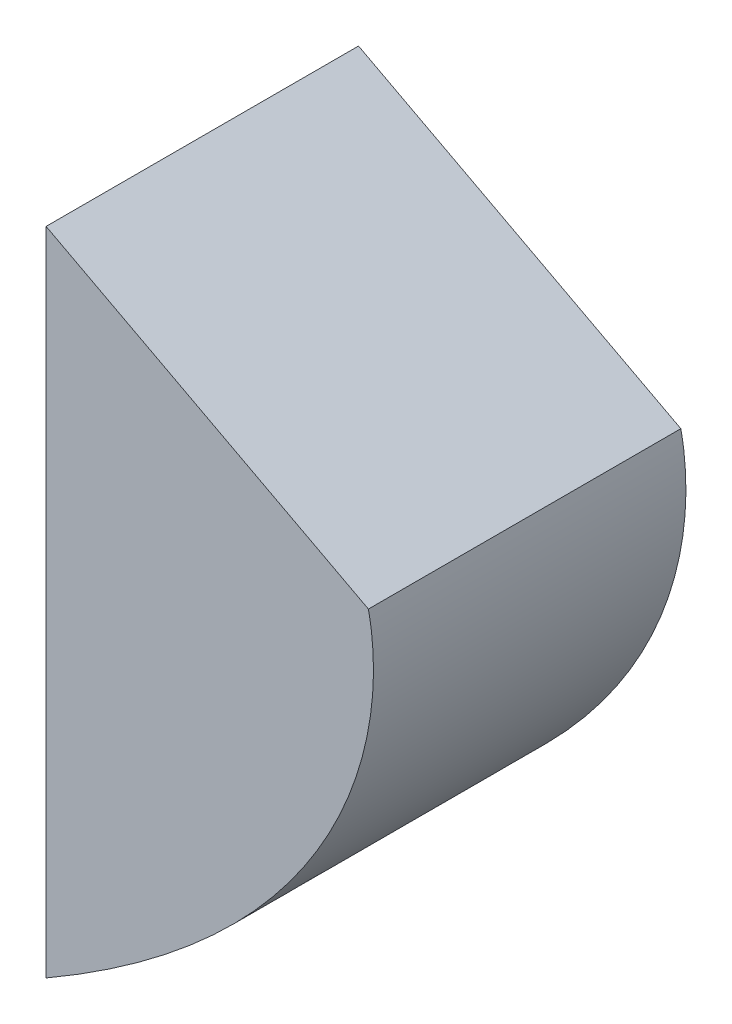
ISO-10303-21;
HEADER;
FILE_DESCRIPTION(('STEP AP214'),'2;1');
FILE_NAME('part.step','',(''),(''),'','','');
FILE_SCHEMA(('AUTOMOTIVE_DESIGN { 1 0 10303 214 1 1 1 1 }'));
ENDSEC;
DATA;
#1=APPLICATION_CONTEXT('core data for automotive mechanical design processes');
#2=APPLICATION_PROTOCOL_DEFINITION('international standard','automotive_design',2000,#1);
#3=PRODUCT_CONTEXT('',#1,'mechanical');
#4=PRODUCT('Part','Part','',(#3));
#5=PRODUCT_RELATED_PRODUCT_CATEGORY('part','',(#4));
#6=PRODUCT_DEFINITION_FORMATION('','',#4);
#7=PRODUCT_DEFINITION_CONTEXT('part definition',#1,'design');
#8=PRODUCT_DEFINITION('design','',#6,#7);
#9=PRODUCT_DEFINITION_SHAPE('','',#8);
#10=(LENGTH_UNIT() NAMED_UNIT(*) SI_UNIT(.MILLI.,.METRE.));
#11=(NAMED_UNIT(*) PLANE_ANGLE_UNIT() SI_UNIT($,.RADIAN.));
#12=(NAMED_UNIT(*) SI_UNIT($,.STERADIAN.) SOLID_ANGLE_UNIT());
#13=UNCERTAINTY_MEASURE_WITH_UNIT(LENGTH_MEASURE(1.E-05),#10,'distance_accuracy_value','');
#14=(GEOMETRIC_REPRESENTATION_CONTEXT(3) GLOBAL_UNCERTAINTY_ASSIGNED_CONTEXT((#13)) GLOBAL_UNIT_ASSIGNED_CONTEXT((#10,
#11,#12)) REPRESENTATION_CONTEXT('',''));
#15=CARTESIAN_POINT('',(0.,0.,0.));
#16=DIRECTION('',(0.,0.,1.));
#17=DIRECTION('',(1.,0.,0.));
#18=AXIS2_PLACEMENT_3D('',#15,#16,#17);
#19=CARTESIAN_POINT('',(188.442072923053,311.365326383374,240.));
#20=DIRECTION('',(-0.467080484949772,-0.884214804546432,0.));
#21=DIRECTION('',(0.884214804546432,-0.467080484949773,0.));
#22=AXIS2_PLACEMENT_3D('',#19,#20,#21);
#23=PLANE('',#22);
#24=CARTESIAN_POINT('',(188.442072923053,311.365326383374,0.));
#25=CARTESIAN_POINT('',(-59.1380723499483,442.14786216931,0.));
#26=B_SPLINE_CURVE_WITH_KNOTS('',1,(#24,#25),.UNSPECIFIED.,.F.,.F.,(2,2),(0.,1.),.UNSPECIFIED.);
#27=CARTESIAN_POINT('',(188.442072923053,311.365326383374,0.));
#28=VERTEX_POINT('',#27);
#29=CARTESIAN_POINT('',(-59.1380723499483,442.14786216931,0.));
#30=VERTEX_POINT('',#29);
#31=EDGE_CURVE('E109',#28,#30,#26,.T.);
#32=ORIENTED_EDGE('',*,*,#31,.T.);
#33=DIRECTION('',(0.,0.,-1.));
#34=VECTOR('',#33,1.);
#35=CARTESIAN_POINT('',(-59.1380723499483,442.14786216931,240.));
#36=LINE('',#35,#34);
#37=CARTESIAN_POINT('',(-59.1380723499483,442.14786216931,240.));
#38=VERTEX_POINT('',#37);
#39=EDGE_CURVE('E11',#38,#30,#36,.T.);
#40=ORIENTED_EDGE('',*,*,#39,.F.);
#41=CARTESIAN_POINT('',(188.442072923053,311.365326383374,240.));
#42=CARTESIAN_POINT('',(-59.1380723499483,442.14786216931,240.));
#43=B_SPLINE_CURVE_WITH_KNOTS('',1,(#41,#42),.UNSPECIFIED.,.F.,.F.,(2,2),(0.,1.),.UNSPECIFIED.);
#44=CARTESIAN_POINT('',(188.442072923053,311.365326383374,240.));
#45=VERTEX_POINT('',#44);
#46=EDGE_CURVE('E110',#45,#38,#43,.T.);
#47=ORIENTED_EDGE('',*,*,#46,.F.);
#48=DIRECTION('',(0.,0.,-1.));
#49=VECTOR('',#48,1.);
#50=CARTESIAN_POINT('',(188.442072923053,311.365326383374,240.));
#51=LINE('',#50,#49);
#52=EDGE_CURVE('E125',#45,#28,#51,.T.);
#53=ORIENTED_EDGE('',*,*,#52,.T.);
#54=EDGE_LOOP('',(#32,#40,#47,#53));
#55=FACE_BOUND('',#54,.T.);
#56=ADVANCED_FACE('F39',(#55),#23,.F.);
#57=CARTESIAN_POINT('',(-59.1380723499483,442.14786216931,240.));
#58=DIRECTION('',(1.,0.,0.));
#59=DIRECTION('',(0.,1.,0.));
#60=AXIS2_PLACEMENT_3D('',#57,#58,#59);
#61=PLANE('',#60);
#62=CARTESIAN_POINT('',(-59.1380723499483,22.3842029049031,120.));
#63=DIRECTION('',(-1.,0.,0.));
#64=DIRECTION('',(0.,0.,1.));
#65=AXIS2_PLACEMENT_3D('',#62,#63,#64);
#66=CIRCLE('',#65,5.25);
#67=CARTESIAN_POINT('',(-59.1380723499483,22.3842029049031,125.25));
#68=VERTEX_POINT('',#67);
#69=EDGE_CURVE('E96',#68,#68,#66,.T.);
#70=ORIENTED_EDGE('',*,*,#69,.F.);
#71=EDGE_LOOP('',(#70));
#72=FACE_BOUND('',#71,.T.);
#73=CARTESIAN_POINT('',(-59.1380723499483,362.14786216931,120.));
#74=DIRECTION('',(-1.,0.,0.));
#75=DIRECTION('',(0.,0.,1.));
#76=AXIS2_PLACEMENT_3D('',#73,#74,#75);
#77=CIRCLE('',#76,5.24999999999998);
#78=CARTESIAN_POINT('',(-59.1380723499483,362.14786216931,125.25));
#79=VERTEX_POINT('',#78);
#80=EDGE_CURVE('E95',#79,#79,#77,.T.);
#81=ORIENTED_EDGE('',*,*,#80,.F.);
#82=EDGE_LOOP('',(#81));
#83=FACE_BOUND('',#82,.T.);
#84=DIRECTION('',(0.,-1.,0.));
#85=VECTOR('',#84,1.);
#86=CARTESIAN_POINT('',(-59.1380723499483,442.14786216931,0.));
#87=LINE('',#86,#85);
#88=CARTESIAN_POINT('',(-59.1380723499483,-57.8521378306895,0.));
#89=VERTEX_POINT('',#88);
#90=EDGE_CURVE('E69',#30,#89,#87,.T.);
#91=ORIENTED_EDGE('',*,*,#90,.T.);
#92=DIRECTION('',(0.,0.,-1.));
#93=VECTOR('',#92,1.);
#94=CARTESIAN_POINT('',(-59.1380723499483,-57.8521378306895,240.));
#95=LINE('',#94,#93);
#96=CARTESIAN_POINT('',(-59.1380723499483,-57.8521378306895,240.));
#97=VERTEX_POINT('',#96);
#98=EDGE_CURVE('E48',#97,#89,#95,.T.);
#99=ORIENTED_EDGE('',*,*,#98,.F.);
#100=DIRECTION('',(0.,-1.,0.));
#101=VECTOR('',#100,1.);
#102=CARTESIAN_POINT('',(-59.1380723499483,442.14786216931,240.));
#103=LINE('',#102,#101);
#104=EDGE_CURVE('E77',#38,#97,#103,.T.);
#105=ORIENTED_EDGE('',*,*,#104,.F.);
#106=ORIENTED_EDGE('',*,*,#39,.T.);
#107=EDGE_LOOP('',(#91,#99,#105,#106));
#108=FACE_BOUND('',#107,.T.);
#109=ADVANCED_FACE('F137',(#72,#83,#108),#61,.F.);
#110=CARTESIAN_POINT('',(-59.1380723499484,-57.8521378306895,240.));
#111=CARTESIAN_POINT('',(174.913150699823,77.43026531407,240.));
#112=CARTESIAN_POINT('',(205.418964712222,233.266311599294,240.));
#113=CARTESIAN_POINT('',(188.442072923053,311.365326383374,240.));
#114=B_SPLINE_CURVE_WITH_KNOTS('',3,(#110,#111,#112,#113),.UNSPECIFIED.,.F.,.F.,(4,4),(0.,1.),.UNSPECIFIED.);
#115=DIRECTION('',(0.,0.,-1.));
#116=VECTOR('',#115,1.);
#117=SURFACE_OF_LINEAR_EXTRUSION('',#114,#116);
#118=CARTESIAN_POINT('',(-59.1380723499484,-57.8521378306895,0.));
#119=CARTESIAN_POINT('',(174.913150699823,77.43026531407,0.));
#120=CARTESIAN_POINT('',(205.418964712222,233.266311599294,0.));
#121=CARTESIAN_POINT('',(188.442072923053,311.365326383374,0.));
#122=B_SPLINE_CURVE_WITH_KNOTS('',3,(#118,#119,#120,#121),.UNSPECIFIED.,.F.,.F.,(4,4),(0.,1.),.UNSPECIFIED.);
#123=EDGE_CURVE('E74',#89,#28,#122,.T.);
#124=ORIENTED_EDGE('',*,*,#123,.T.);
#125=ORIENTED_EDGE('',*,*,#52,.F.);
#126=EDGE_CURVE('E56',#97,#45,#114,.T.);
#127=ORIENTED_EDGE('',*,*,#126,.F.);
#128=ORIENTED_EDGE('',*,*,#98,.T.);
#129=EDGE_LOOP('',(#124,#125,#127,#128));
#130=FACE_BOUND('',#129,.T.);
#131=ADVANCED_FACE('F133',(#130),#117,.F.);
#132=CARTESIAN_POINT('',(158.787543351155,148.200364911597,240.));
#133=DIRECTION('',(0.,0.,1.));
#134=DIRECTION('',(1.,0.,0.));
#135=AXIS2_PLACEMENT_3D('',#132,#133,#134);
#136=PLANE('',#135);
#137=ORIENTED_EDGE('',*,*,#46,.T.);
#138=ORIENTED_EDGE('',*,*,#104,.T.);
#139=ORIENTED_EDGE('',*,*,#126,.T.);
#140=EDGE_LOOP('',(#137,#138,#139));
#141=FACE_BOUND('',#140,.T.);
#142=ADVANCED_FACE('F136',(#141),#136,.T.);
#143=CARTESIAN_POINT('',(158.787543351155,148.200364911597,0.));
#144=DIRECTION('',(0.,0.,1.));
#145=DIRECTION('',(1.,0.,0.));
#146=AXIS2_PLACEMENT_3D('',#143,#144,#145);
#147=PLANE('',#146);
#148=ORIENTED_EDGE('',*,*,#31,.F.);
#149=ORIENTED_EDGE('',*,*,#123,.F.);
#150=ORIENTED_EDGE('',*,*,#90,.F.);
#151=EDGE_LOOP('',(#148,#149,#150));
#152=FACE_BOUND('',#151,.T.);
#153=ADVANCED_FACE('F138',(#152),#147,.F.);
#154=CARTESIAN_POINT('',(-49.1380723499483,362.14786216931,120.));
#155=DIRECTION('',(-1.,0.,0.));
#156=DIRECTION('',(0.,0.,1.));
#157=AXIS2_PLACEMENT_3D('',#154,#155,#156);
#158=CONICAL_SURFACE('',#157,5.24999999999998,1.09955742875643);
#159=CARTESIAN_POINT('',(-46.4630637401026,362.14786216931,120.));
#160=VERTEX_POINT('',#159);
#161=VERTEX_LOOP('',#160);
#162=FACE_BOUND('',#161,.T.);
#163=CARTESIAN_POINT('',(-49.1380723499483,362.14786216931,120.));
#164=DIRECTION('',(-1.,0.,0.));
#165=DIRECTION('',(0.,0.,1.));
#166=AXIS2_PLACEMENT_3D('',#163,#164,#165);
#167=CIRCLE('',#166,5.24999999999998);
#168=CARTESIAN_POINT('',(-49.1380723499483,362.14786216931,125.25));
#169=VERTEX_POINT('',#168);
#170=EDGE_CURVE('E101',#169,#169,#167,.T.);
#171=ORIENTED_EDGE('',*,*,#170,.T.);
#172=EDGE_LOOP('',(#171));
#173=FACE_BOUND('',#172,.T.);
#174=ADVANCED_FACE('F151',(#162,#173),#158,.F.);
#175=CARTESIAN_POINT('',(-59.1380723499483,362.14786216931,120.));
#176=DIRECTION('',(-1.,0.,0.));
#177=DIRECTION('',(0.,0.,1.));
#178=AXIS2_PLACEMENT_3D('',#175,#176,#177);
#179=CYLINDRICAL_SURFACE('',#178,5.24999999999998);
#180=ORIENTED_EDGE('',*,*,#170,.F.);
#181=EDGE_LOOP('',(#180));
#182=FACE_BOUND('',#181,.T.);
#183=ORIENTED_EDGE('',*,*,#80,.T.);
#184=EDGE_LOOP('',(#183));
#185=FACE_BOUND('',#184,.T.);
#186=ADVANCED_FACE('F88',(#182,#185),#179,.F.);
#187=CARTESIAN_POINT('',(-49.1380723499483,22.3842029049031,120.));
#188=DIRECTION('',(-1.,0.,0.));
#189=DIRECTION('',(0.,0.,1.));
#190=AXIS2_PLACEMENT_3D('',#187,#188,#189);
#191=CONICAL_SURFACE('',#190,5.25,1.02974425867665);
#192=CARTESIAN_POINT('',(-45.9835541000537,22.3842029049031,120.));
#193=VERTEX_POINT('',#192);
#194=VERTEX_LOOP('',#193);
#195=FACE_BOUND('',#194,.T.);
#196=CARTESIAN_POINT('',(-49.1380723499483,22.3842029049031,120.));
#197=DIRECTION('',(-1.,0.,0.));
#198=DIRECTION('',(0.,0.,1.));
#199=AXIS2_PLACEMENT_3D('',#196,#197,#198);
#200=CIRCLE('',#199,5.25);
#201=CARTESIAN_POINT('',(-49.1380723499483,22.3842029049031,125.25));
#202=VERTEX_POINT('',#201);
#203=EDGE_CURVE('E92',#202,#202,#200,.T.);
#204=ORIENTED_EDGE('',*,*,#203,.T.);
#205=EDGE_LOOP('',(#204));
#206=FACE_BOUND('',#205,.T.);
#207=ADVANCED_FACE('F84',(#195,#206),#191,.F.);
#208=CARTESIAN_POINT('',(-59.1380723499483,22.3842029049031,120.));
#209=DIRECTION('',(-1.,0.,0.));
#210=DIRECTION('',(0.,0.,1.));
#211=AXIS2_PLACEMENT_3D('',#208,#209,#210);
#212=CYLINDRICAL_SURFACE('',#211,5.25);
#213=ORIENTED_EDGE('',*,*,#203,.F.);
#214=EDGE_LOOP('',(#213));
#215=FACE_BOUND('',#214,.T.);
#216=ORIENTED_EDGE('',*,*,#69,.T.);
#217=EDGE_LOOP('',(#216));
#218=FACE_BOUND('',#217,.T.);
#219=ADVANCED_FACE('F87',(#215,#218),#212,.F.);
#220=CLOSED_SHELL('',(#56,#109,#131,#142,#153,#174,#186,#207,#219));
#221=MANIFOLD_SOLID_BREP('B2',#220);
#222=ADVANCED_BREP_SHAPE_REPRESENTATION('',(#18,#221),#14);
#223=SHAPE_DEFINITION_REPRESENTATION(#9,#222);
ENDSEC;
END-ISO-10303-21;
